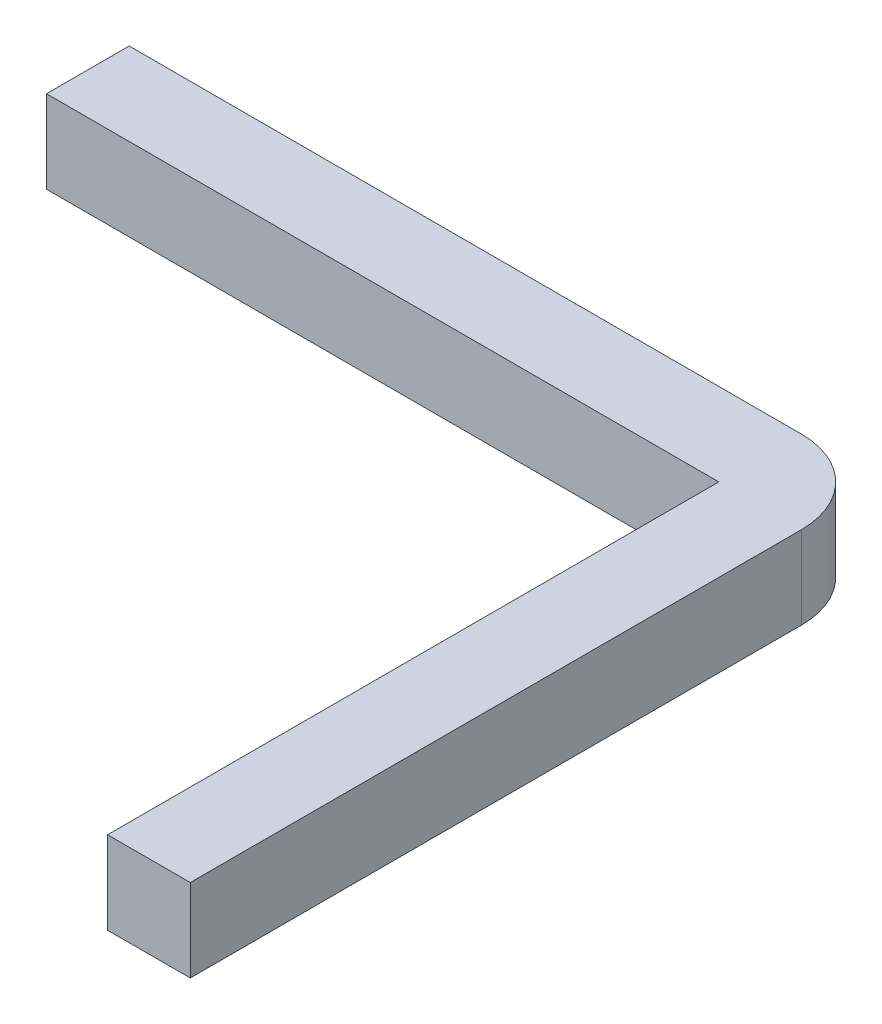
ISO-10303-21;
HEADER;
FILE_DESCRIPTION(('STEP AP214'),'2;1');
FILE_NAME('part.step','',(''),(''),'','','');
FILE_SCHEMA(('AUTOMOTIVE_DESIGN { 1 0 10303 214 1 1 1 1 }'));
ENDSEC;
DATA;
#1=APPLICATION_CONTEXT('core data for automotive mechanical design processes');
#2=APPLICATION_PROTOCOL_DEFINITION('international standard','automotive_design',2000,#1);
#3=PRODUCT_CONTEXT('',#1,'mechanical');
#4=PRODUCT('Part','Part','',(#3));
#5=PRODUCT_RELATED_PRODUCT_CATEGORY('part','',(#4));
#6=PRODUCT_DEFINITION_FORMATION('','',#4);
#7=PRODUCT_DEFINITION_CONTEXT('part definition',#1,'design');
#8=PRODUCT_DEFINITION('design','',#6,#7);
#9=PRODUCT_DEFINITION_SHAPE('','',#8);
#10=(LENGTH_UNIT() NAMED_UNIT(*) SI_UNIT(.MILLI.,.METRE.));
#11=(NAMED_UNIT(*) PLANE_ANGLE_UNIT() SI_UNIT($,.RADIAN.));
#12=(NAMED_UNIT(*) SI_UNIT($,.STERADIAN.) SOLID_ANGLE_UNIT());
#13=UNCERTAINTY_MEASURE_WITH_UNIT(LENGTH_MEASURE(1.E-05),#10,'distance_accuracy_value','');
#14=(GEOMETRIC_REPRESENTATION_CONTEXT(3) GLOBAL_UNCERTAINTY_ASSIGNED_CONTEXT((#13)) GLOBAL_UNIT_ASSIGNED_CONTEXT((#10,
#11,#12)) REPRESENTATION_CONTEXT('',''));
#15=CARTESIAN_POINT('',(0.,0.,0.));
#16=DIRECTION('',(0.,0.,1.));
#17=DIRECTION('',(1.,0.,0.));
#18=AXIS2_PLACEMENT_3D('',#15,#16,#17);
#19=CARTESIAN_POINT('',(82.,0.,23.));
#20=DIRECTION('',(0.,-1.,0.));
#21=DIRECTION('',(0.,0.,-1.));
#22=AXIS2_PLACEMENT_3D('',#19,#20,#21);
#23=CYLINDRICAL_SURFACE('',#22,23.);
#24=DIRECTION('',(0.,-1.,0.));
#25=VECTOR('',#24,1.);
#26=CARTESIAN_POINT('',(82.,0.,0.));
#27=LINE('',#26,#25);
#28=CARTESIAN_POINT('',(82.,11.5,0.));
#29=VERTEX_POINT('',#28);
#30=CARTESIAN_POINT('',(82.0000000000001,-11.5,0.));
#31=VERTEX_POINT('',#30);
#32=EDGE_CURVE('E241',#29,#31,#27,.T.);
#33=ORIENTED_EDGE('',*,*,#32,.F.);
#34=CARTESIAN_POINT('',(82.,11.5,23.));
#35=DIRECTION('',(0.,-1.,0.));
#36=DIRECTION('',(0.,0.,-1.));
#37=AXIS2_PLACEMENT_3D('',#34,#35,#36);
#38=CIRCLE('',#37,23.);
#39=CARTESIAN_POINT('',(105.,11.5,23.));
#40=VERTEX_POINT('',#39);
#41=EDGE_CURVE('E55',#40,#29,#38,.F.);
#42=ORIENTED_EDGE('',*,*,#41,.F.);
#43=DIRECTION('',(0.,1.,0.));
#44=VECTOR('',#43,1.);
#45=CARTESIAN_POINT('',(105.,11.5,23.));
#46=LINE('',#45,#44);
#47=CARTESIAN_POINT('',(105.,-11.5,23.));
#48=VERTEX_POINT('',#47);
#49=EDGE_CURVE('E211',#48,#40,#46,.T.);
#50=ORIENTED_EDGE('',*,*,#49,.F.);
#51=CARTESIAN_POINT('',(82.,-11.5,23.));
#52=DIRECTION('',(0.,1.,0.));
#53=DIRECTION('',(0.,0.,1.));
#54=AXIS2_PLACEMENT_3D('',#51,#52,#53);
#55=CIRCLE('',#54,23.);
#56=EDGE_CURVE('E11',#31,#48,#55,.F.);
#57=ORIENTED_EDGE('',*,*,#56,.F.);
#58=EDGE_LOOP('',(#33,#42,#50,#57));
#59=FACE_BOUND('',#58,.T.);
#60=ADVANCED_FACE('F47',(#59),#23,.T.);
#61=CARTESIAN_POINT('',(-105.,11.5,23.));
#62=DIRECTION('',(0.,-1.,0.));
#63=DIRECTION('',(0.,0.,-1.));
#64=AXIS2_PLACEMENT_3D('',#61,#62,#63);
#65=PLANE('',#64);
#66=DIRECTION('',(-1.,0.,0.));
#67=VECTOR('',#66,1.);
#68=CARTESIAN_POINT('',(-105.,11.5,23.));
#69=LINE('',#68,#67);
#70=CARTESIAN_POINT('',(82.,11.5,23.));
#71=VERTEX_POINT('',#70);
#72=CARTESIAN_POINT('',(-105.,11.5,23.));
#73=VERTEX_POINT('',#72);
#74=EDGE_CURVE('E215',#71,#73,#69,.T.);
#75=ORIENTED_EDGE('',*,*,#74,.F.);
#76=DIRECTION('',(0.,0.,-1.));
#77=VECTOR('',#76,1.);
#78=CARTESIAN_POINT('',(82.,11.5,193.));
#79=LINE('',#78,#77);
#80=CARTESIAN_POINT('',(82.,11.5,193.));
#81=VERTEX_POINT('',#80);
#82=EDGE_CURVE('E192',#81,#71,#79,.T.);
#83=ORIENTED_EDGE('',*,*,#82,.F.);
#84=DIRECTION('',(-1.,0.,0.));
#85=VECTOR('',#84,1.);
#86=CARTESIAN_POINT('',(82.,11.5,193.));
#87=LINE('',#86,#85);
#88=CARTESIAN_POINT('',(105.,11.5,193.));
#89=VERTEX_POINT('',#88);
#90=EDGE_CURVE('E189',#89,#81,#87,.T.);
#91=ORIENTED_EDGE('',*,*,#90,.F.);
#92=DIRECTION('',(0.,0.,-1.));
#93=VECTOR('',#92,1.);
#94=CARTESIAN_POINT('',(105.,11.5,193.));
#95=LINE('',#94,#93);
#96=EDGE_CURVE('E198',#89,#40,#95,.T.);
#97=ORIENTED_EDGE('',*,*,#96,.T.);
#98=ORIENTED_EDGE('',*,*,#41,.T.);
#99=DIRECTION('',(-1.,0.,0.));
#100=VECTOR('',#99,1.);
#101=CARTESIAN_POINT('',(-105.,11.5,0.));
#102=LINE('',#101,#100);
#103=CARTESIAN_POINT('',(-105.,11.5,0.));
#104=VERTEX_POINT('',#103);
#105=EDGE_CURVE('E210',#29,#104,#102,.T.);
#106=ORIENTED_EDGE('',*,*,#105,.T.);
#107=DIRECTION('',(0.,0.,-1.));
#108=VECTOR('',#107,1.);
#109=CARTESIAN_POINT('',(-105.,11.5,23.));
#110=LINE('',#109,#108);
#111=EDGE_CURVE('E237',#73,#104,#110,.T.);
#112=ORIENTED_EDGE('',*,*,#111,.F.);
#113=EDGE_LOOP('',(#75,#83,#91,#97,#98,#106,#112));
#114=FACE_BOUND('',#113,.T.);
#115=ADVANCED_FACE('F247',(#114),#65,.F.);
#116=CARTESIAN_POINT('',(-105.,11.5,23.));
#117=DIRECTION('',(1.,0.,0.));
#118=DIRECTION('',(0.,1.,0.));
#119=AXIS2_PLACEMENT_3D('',#116,#117,#118);
#120=PLANE('',#119);
#121=DIRECTION('',(0.,0.,-1.));
#122=VECTOR('',#121,1.);
#123=CARTESIAN_POINT('',(-105.,9.49999999999994,1.93585631275248));
#124=LINE('',#123,#122);
#125=CARTESIAN_POINT('',(-105.,9.49999999999994,20.9358563127525));
#126=VERTEX_POINT('',#125);
#127=CARTESIAN_POINT('',(-105.,9.49999999999994,1.93585631275248));
#128=VERTEX_POINT('',#127);
#129=EDGE_CURVE('E165',#126,#128,#124,.T.);
#130=ORIENTED_EDGE('',*,*,#129,.F.);
#131=DIRECTION('',(0.,1.,0.));
#132=VECTOR('',#131,1.);
#133=CARTESIAN_POINT('',(-105.,-9.50000000000007,20.9358563127525));
#134=LINE('',#133,#132);
#135=CARTESIAN_POINT('',(-105.,-9.50000000000007,20.9358563127525));
#136=VERTEX_POINT('',#135);
#137=EDGE_CURVE('E62',#136,#126,#134,.T.);
#138=ORIENTED_EDGE('',*,*,#137,.F.);
#139=DIRECTION('',(0.,0.,1.));
#140=VECTOR('',#139,1.);
#141=CARTESIAN_POINT('',(-105.,-9.50000000000007,1.93585631275248));
#142=LINE('',#141,#140);
#143=CARTESIAN_POINT('',(-105.,-9.50000000000007,1.93585631275248));
#144=VERTEX_POINT('',#143);
#145=EDGE_CURVE('E152',#144,#136,#142,.T.);
#146=ORIENTED_EDGE('',*,*,#145,.F.);
#147=DIRECTION('',(0.,-1.,0.));
#148=VECTOR('',#147,1.);
#149=CARTESIAN_POINT('',(-105.,-9.50000000000007,1.93585631275248));
#150=LINE('',#149,#148);
#151=EDGE_CURVE('E156',#128,#144,#150,.T.);
#152=ORIENTED_EDGE('',*,*,#151,.F.);
#153=EDGE_LOOP('',(#130,#138,#146,#152));
#154=FACE_BOUND('',#153,.T.);
#155=DIRECTION('',(0.,-1.,0.));
#156=VECTOR('',#155,1.);
#157=CARTESIAN_POINT('',(-105.,11.5,0.));
#158=LINE('',#157,#156);
#159=CARTESIAN_POINT('',(-105.,-11.5,0.));
#160=VERTEX_POINT('',#159);
#161=EDGE_CURVE('E228',#104,#160,#158,.T.);
#162=ORIENTED_EDGE('',*,*,#161,.T.);
#163=DIRECTION('',(0.,0.,-1.));
#164=VECTOR('',#163,1.);
#165=CARTESIAN_POINT('',(-105.,-11.5,23.));
#166=LINE('',#165,#164);
#167=CARTESIAN_POINT('',(-105.,-11.5,23.));
#168=VERTEX_POINT('',#167);
#169=EDGE_CURVE('E225',#168,#160,#166,.T.);
#170=ORIENTED_EDGE('',*,*,#169,.F.);
#171=DIRECTION('',(0.,-1.,0.));
#172=VECTOR('',#171,1.);
#173=CARTESIAN_POINT('',(-105.,11.5,23.));
#174=LINE('',#173,#172);
#175=EDGE_CURVE('E219',#73,#168,#174,.T.);
#176=ORIENTED_EDGE('',*,*,#175,.F.);
#177=ORIENTED_EDGE('',*,*,#111,.T.);
#178=EDGE_LOOP('',(#162,#170,#176,#177));
#179=FACE_BOUND('',#178,.T.);
#180=ADVANCED_FACE('F260',(#154,#179),#120,.F.);
#181=CARTESIAN_POINT('',(-105.,-11.5,23.));
#182=DIRECTION('',(0.,1.,0.));
#183=DIRECTION('',(0.,0.,1.));
#184=AXIS2_PLACEMENT_3D('',#181,#182,#183);
#185=PLANE('',#184);
#186=DIRECTION('',(1.,0.,0.));
#187=VECTOR('',#186,1.);
#188=CARTESIAN_POINT('',(-105.,-11.5,0.));
#189=LINE('',#188,#187);
#190=EDGE_CURVE('E216',#160,#31,#189,.T.);
#191=ORIENTED_EDGE('',*,*,#190,.T.);
#192=ORIENTED_EDGE('',*,*,#56,.T.);
#193=DIRECTION('',(0.,0.,-1.));
#194=VECTOR('',#193,1.);
#195=CARTESIAN_POINT('',(105.,-11.5,193.));
#196=LINE('',#195,#194);
#197=CARTESIAN_POINT('',(105.,-11.5,193.));
#198=VERTEX_POINT('',#197);
#199=EDGE_CURVE('E202',#198,#48,#196,.T.);
#200=ORIENTED_EDGE('',*,*,#199,.F.);
#201=DIRECTION('',(1.,0.,0.));
#202=VECTOR('',#201,1.);
#203=CARTESIAN_POINT('',(82.,-11.5,193.));
#204=LINE('',#203,#202);
#205=CARTESIAN_POINT('',(82.,-11.5,193.));
#206=VERTEX_POINT('',#205);
#207=EDGE_CURVE('E183',#206,#198,#204,.T.);
#208=ORIENTED_EDGE('',*,*,#207,.F.);
#209=DIRECTION('',(0.,0.,-1.));
#210=VECTOR('',#209,1.);
#211=CARTESIAN_POINT('',(82.,-11.5,193.));
#212=LINE('',#211,#210);
#213=CARTESIAN_POINT('',(82.,-11.5,23.));
#214=VERTEX_POINT('',#213);
#215=EDGE_CURVE('E206',#206,#214,#212,.T.);
#216=ORIENTED_EDGE('',*,*,#215,.T.);
#217=DIRECTION('',(1.,0.,0.));
#218=VECTOR('',#217,1.);
#219=CARTESIAN_POINT('',(-105.,-11.5,23.));
#220=LINE('',#219,#218);
#221=EDGE_CURVE('E222',#168,#214,#220,.T.);
#222=ORIENTED_EDGE('',*,*,#221,.F.);
#223=ORIENTED_EDGE('',*,*,#169,.T.);
#224=EDGE_LOOP('',(#191,#192,#200,#208,#216,#222,#223));
#225=FACE_BOUND('',#224,.T.);
#226=ADVANCED_FACE('F264',(#225),#185,.F.);
#227=CARTESIAN_POINT('',(0.,0.,23.));
#228=DIRECTION('',(0.,0.,1.));
#229=DIRECTION('',(1.,0.,0.));
#230=AXIS2_PLACEMENT_3D('',#227,#228,#229);
#231=PLANE('',#230);
#232=DIRECTION('',(0.,-1.,0.));
#233=VECTOR('',#232,1.);
#234=CARTESIAN_POINT('',(82.,-11.5,23.));
#235=LINE('',#234,#233);
#236=EDGE_CURVE('E70',#71,#214,#235,.T.);
#237=ORIENTED_EDGE('',*,*,#236,.F.);
#238=ORIENTED_EDGE('',*,*,#74,.T.);
#239=ORIENTED_EDGE('',*,*,#175,.T.);
#240=ORIENTED_EDGE('',*,*,#221,.T.);
#241=EDGE_LOOP('',(#237,#238,#239,#240));
#242=FACE_BOUND('',#241,.T.);
#243=ADVANCED_FACE('F266',(#242),#231,.T.);
#244=CARTESIAN_POINT('',(0.,0.,0.));
#245=DIRECTION('',(0.,0.,1.));
#246=DIRECTION('',(1.,0.,0.));
#247=AXIS2_PLACEMENT_3D('',#244,#245,#246);
#248=PLANE('',#247);
#249=ORIENTED_EDGE('',*,*,#105,.F.);
#250=ORIENTED_EDGE('',*,*,#32,.T.);
#251=ORIENTED_EDGE('',*,*,#190,.F.);
#252=ORIENTED_EDGE('',*,*,#161,.F.);
#253=EDGE_LOOP('',(#249,#250,#251,#252));
#254=FACE_BOUND('',#253,.T.);
#255=ADVANCED_FACE('F257',(#254),#248,.F.);
#256=CARTESIAN_POINT('',(82.,-11.5,193.));
#257=DIRECTION('',(1.,0.,0.));
#258=DIRECTION('',(0.,0.,-1.));
#259=AXIS2_PLACEMENT_3D('',#256,#257,#258);
#260=PLANE('',#259);
#261=ORIENTED_EDGE('',*,*,#236,.T.);
#262=ORIENTED_EDGE('',*,*,#215,.F.);
#263=DIRECTION('',(0.,-1.,0.));
#264=VECTOR('',#263,1.);
#265=CARTESIAN_POINT('',(82.,-11.5,193.));
#266=LINE('',#265,#264);
#267=EDGE_CURVE('E179',#81,#206,#266,.T.);
#268=ORIENTED_EDGE('',*,*,#267,.F.);
#269=ORIENTED_EDGE('',*,*,#82,.T.);
#270=EDGE_LOOP('',(#261,#262,#268,#269));
#271=FACE_BOUND('',#270,.T.);
#272=ADVANCED_FACE('F270',(#271),#260,.F.);
#273=CARTESIAN_POINT('',(105.,-11.5,193.));
#274=DIRECTION('',(-1.,0.,0.));
#275=DIRECTION('',(0.,0.,1.));
#276=AXIS2_PLACEMENT_3D('',#273,#274,#275);
#277=PLANE('',#276);
#278=ORIENTED_EDGE('',*,*,#49,.T.);
#279=ORIENTED_EDGE('',*,*,#96,.F.);
#280=DIRECTION('',(0.,1.,0.));
#281=VECTOR('',#280,1.);
#282=CARTESIAN_POINT('',(105.,-11.5,193.));
#283=LINE('',#282,#281);
#284=EDGE_CURVE('E186',#198,#89,#283,.T.);
#285=ORIENTED_EDGE('',*,*,#284,.F.);
#286=ORIENTED_EDGE('',*,*,#199,.T.);
#287=EDGE_LOOP('',(#278,#279,#285,#286));
#288=FACE_BOUND('',#287,.T.);
#289=ADVANCED_FACE('F276',(#288),#277,.F.);
#290=CARTESIAN_POINT('',(0.,0.,193.));
#291=DIRECTION('',(0.,0.,-1.));
#292=DIRECTION('',(-1.,0.,0.));
#293=AXIS2_PLACEMENT_3D('',#290,#291,#292);
#294=PLANE('',#293);
#295=ORIENTED_EDGE('',*,*,#267,.T.);
#296=ORIENTED_EDGE('',*,*,#207,.T.);
#297=ORIENTED_EDGE('',*,*,#284,.T.);
#298=ORIENTED_EDGE('',*,*,#90,.T.);
#299=EDGE_LOOP('',(#295,#296,#297,#298));
#300=FACE_BOUND('',#299,.T.);
#301=ADVANCED_FACE('F272',(#300),#294,.F.);
#302=CARTESIAN_POINT('',(-25.,-9.50000000000002,20.9358563127525));
#303=DIRECTION('',(0.,0.,1.));
#304=DIRECTION('',(1.,0.,0.));
#305=AXIS2_PLACEMENT_3D('',#302,#303,#304);
#306=PLANE('',#305);
#307=ORIENTED_EDGE('',*,*,#137,.T.);
#308=DIRECTION('',(-1.,0.,0.));
#309=VECTOR('',#308,1.);
#310=CARTESIAN_POINT('',(-25.,9.49999999999999,20.9358563127525));
#311=LINE('',#310,#309);
#312=CARTESIAN_POINT('',(-25.,9.49999999999999,20.9358563127525));
#313=VERTEX_POINT('',#312);
#314=EDGE_CURVE('E127',#313,#126,#311,.T.);
#315=ORIENTED_EDGE('',*,*,#314,.F.);
#316=DIRECTION('',(0.,1.,0.));
#317=VECTOR('',#316,1.);
#318=CARTESIAN_POINT('',(-25.,-9.50000000000002,20.9358563127525));
#319=LINE('',#318,#317);
#320=CARTESIAN_POINT('',(-25.,-9.50000000000002,20.9358563127525));
#321=VERTEX_POINT('',#320);
#322=EDGE_CURVE('E131',#321,#313,#319,.T.);
#323=ORIENTED_EDGE('',*,*,#322,.F.);
#324=DIRECTION('',(-1.,0.,0.));
#325=VECTOR('',#324,1.);
#326=CARTESIAN_POINT('',(-25.,-9.50000000000002,20.9358563127525));
#327=LINE('',#326,#325);
#328=EDGE_CURVE('E171',#321,#136,#327,.T.);
#329=ORIENTED_EDGE('',*,*,#328,.T.);
#330=EDGE_LOOP('',(#307,#315,#323,#329));
#331=FACE_BOUND('',#330,.T.);
#332=ADVANCED_FACE('F129',(#331),#306,.F.);
#333=CARTESIAN_POINT('',(-25.,-9.50000000000002,1.93585631275248));
#334=DIRECTION('',(0.,-1.,0.));
#335=DIRECTION('',(1.,0.,0.));
#336=AXIS2_PLACEMENT_3D('',#333,#334,#335);
#337=PLANE('',#336);
#338=ORIENTED_EDGE('',*,*,#145,.T.);
#339=ORIENTED_EDGE('',*,*,#328,.F.);
#340=DIRECTION('',(0.,0.,1.));
#341=VECTOR('',#340,1.);
#342=CARTESIAN_POINT('',(-25.,-9.50000000000002,1.93585631275248));
#343=LINE('',#342,#341);
#344=CARTESIAN_POINT('',(-25.,-9.50000000000002,1.93585631275248));
#345=VERTEX_POINT('',#344);
#346=EDGE_CURVE('E138',#345,#321,#343,.T.);
#347=ORIENTED_EDGE('',*,*,#346,.F.);
#348=DIRECTION('',(-1.,0.,0.));
#349=VECTOR('',#348,1.);
#350=CARTESIAN_POINT('',(-25.,-9.50000000000002,1.93585631275248));
#351=LINE('',#350,#349);
#352=EDGE_CURVE('E174',#345,#144,#351,.T.);
#353=ORIENTED_EDGE('',*,*,#352,.T.);
#354=EDGE_LOOP('',(#338,#339,#347,#353));
#355=FACE_BOUND('',#354,.T.);
#356=ADVANCED_FACE('F336',(#355),#337,.F.);
#357=CARTESIAN_POINT('',(-25.,-9.50000000000002,1.93585631275248));
#358=DIRECTION('',(0.,0.,-1.));
#359=DIRECTION('',(-1.,0.,0.));
#360=AXIS2_PLACEMENT_3D('',#357,#358,#359);
#361=PLANE('',#360);
#362=ORIENTED_EDGE('',*,*,#151,.T.);
#363=ORIENTED_EDGE('',*,*,#352,.F.);
#364=DIRECTION('',(0.,-1.,0.));
#365=VECTOR('',#364,1.);
#366=CARTESIAN_POINT('',(-25.,-9.50000000000002,1.93585631275248));
#367=LINE('',#366,#365);
#368=CARTESIAN_POINT('',(-25.,9.49999999999999,1.93585631275248));
#369=VERTEX_POINT('',#368);
#370=EDGE_CURVE('E147',#369,#345,#367,.T.);
#371=ORIENTED_EDGE('',*,*,#370,.F.);
#372=DIRECTION('',(-1.,0.,0.));
#373=VECTOR('',#372,1.);
#374=CARTESIAN_POINT('',(-25.,9.49999999999999,1.93585631275248));
#375=LINE('',#374,#373);
#376=EDGE_CURVE('E137',#369,#128,#375,.T.);
#377=ORIENTED_EDGE('',*,*,#376,.T.);
#378=EDGE_LOOP('',(#362,#363,#371,#377));
#379=FACE_BOUND('',#378,.T.);
#380=ADVANCED_FACE('F344',(#379),#361,.F.);
#381=CARTESIAN_POINT('',(-25.,9.49999999999999,1.93585631275248));
#382=DIRECTION('',(0.,1.,0.));
#383=DIRECTION('',(-1.,0.,0.));
#384=AXIS2_PLACEMENT_3D('',#381,#382,#383);
#385=PLANE('',#384);
#386=ORIENTED_EDGE('',*,*,#129,.T.);
#387=ORIENTED_EDGE('',*,*,#376,.F.);
#388=DIRECTION('',(0.,0.,-1.));
#389=VECTOR('',#388,1.);
#390=CARTESIAN_POINT('',(-25.,9.49999999999999,1.93585631275248));
#391=LINE('',#390,#389);
#392=EDGE_CURVE('E141',#313,#369,#391,.T.);
#393=ORIENTED_EDGE('',*,*,#392,.F.);
#394=ORIENTED_EDGE('',*,*,#314,.T.);
#395=EDGE_LOOP('',(#386,#387,#393,#394));
#396=FACE_BOUND('',#395,.T.);
#397=ADVANCED_FACE('F142',(#396),#385,.F.);
#398=CARTESIAN_POINT('',(-25.,0.,0.));
#399=DIRECTION('',(1.,0.,0.));
#400=DIRECTION('',(0.,0.,-1.));
#401=AXIS2_PLACEMENT_3D('',#398,#399,#400);
#402=PLANE('',#401);
#403=ORIENTED_EDGE('',*,*,#322,.T.);
#404=ORIENTED_EDGE('',*,*,#392,.T.);
#405=ORIENTED_EDGE('',*,*,#370,.T.);
#406=ORIENTED_EDGE('',*,*,#346,.T.);
#407=EDGE_LOOP('',(#403,#404,#405,#406));
#408=FACE_BOUND('',#407,.T.);
#409=ADVANCED_FACE('F149',(#408),#402,.F.);
#410=CLOSED_SHELL('',(#60,#115,#180,#226,#243,#255,#272,#289,#301,#332,#356,#380,#397,#409));
#411=MANIFOLD_SOLID_BREP('B2',#410);
#412=ADVANCED_BREP_SHAPE_REPRESENTATION('',(#18,#411),#14);
#413=SHAPE_DEFINITION_REPRESENTATION(#9,#412);
ENDSEC;
END-ISO-10303-21;
